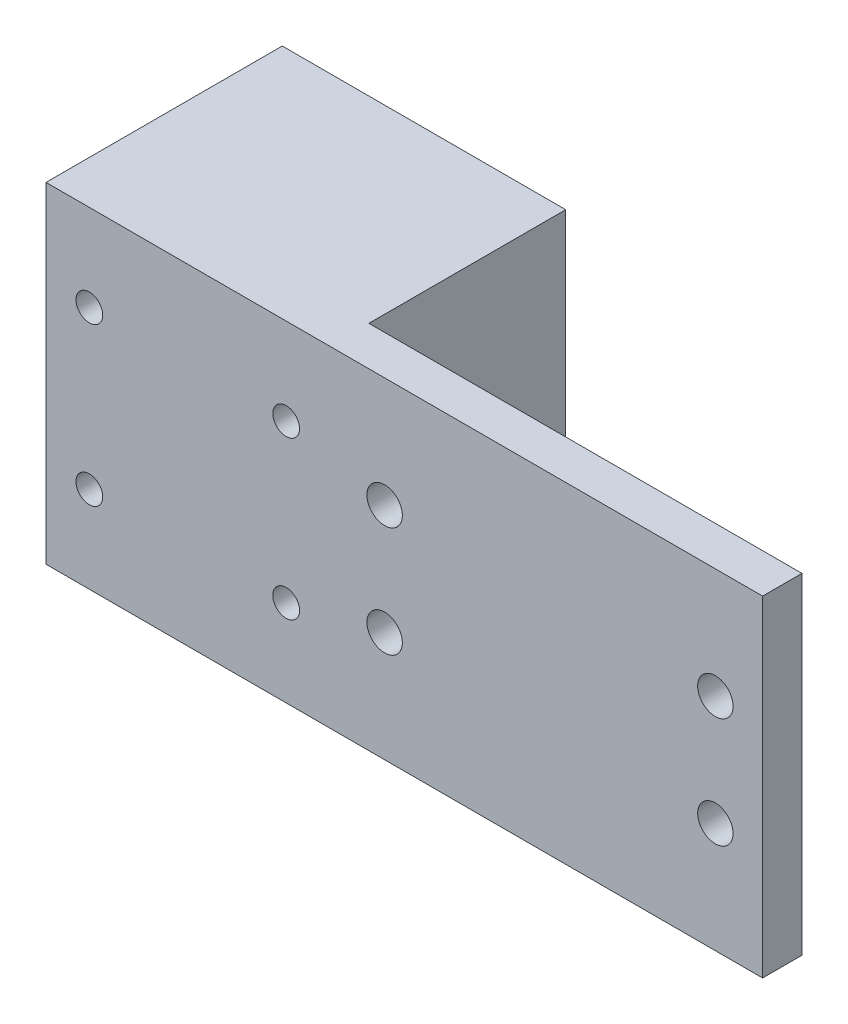
ISO-10303-21;
HEADER;
FILE_DESCRIPTION(('STEP AP214'),'2;1');
FILE_NAME('part.step','',(''),(''),'','','');
FILE_SCHEMA(('AUTOMOTIVE_DESIGN { 1 0 10303 214 1 1 1 1 }'));
ENDSEC;
DATA;
#1=APPLICATION_CONTEXT('core data for automotive mechanical design processes');
#2=APPLICATION_PROTOCOL_DEFINITION('international standard','automotive_design',2000,#1);
#3=PRODUCT_CONTEXT('',#1,'mechanical');
#4=PRODUCT('Part','Part','',(#3));
#5=PRODUCT_RELATED_PRODUCT_CATEGORY('part','',(#4));
#6=PRODUCT_DEFINITION_FORMATION('','',#4);
#7=PRODUCT_DEFINITION_CONTEXT('part definition',#1,'design');
#8=PRODUCT_DEFINITION('design','',#6,#7);
#9=PRODUCT_DEFINITION_SHAPE('','',#8);
#10=(LENGTH_UNIT() NAMED_UNIT(*) SI_UNIT(.MILLI.,.METRE.));
#11=(NAMED_UNIT(*) PLANE_ANGLE_UNIT() SI_UNIT($,.RADIAN.));
#12=(NAMED_UNIT(*) SI_UNIT($,.STERADIAN.) SOLID_ANGLE_UNIT());
#13=UNCERTAINTY_MEASURE_WITH_UNIT(LENGTH_MEASURE(1.E-05),#10,'distance_accuracy_value','');
#14=(GEOMETRIC_REPRESENTATION_CONTEXT(3) GLOBAL_UNCERTAINTY_ASSIGNED_CONTEXT((#13)) GLOBAL_UNIT_ASSIGNED_CONTEXT((#10,
#11,#12)) REPRESENTATION_CONTEXT('',''));
#15=CARTESIAN_POINT('',(0.,0.,0.));
#16=DIRECTION('',(0.,0.,1.));
#17=DIRECTION('',(1.,0.,0.));
#18=AXIS2_PLACEMENT_3D('',#15,#16,#17);
#19=CARTESIAN_POINT('',(91.,42.,0.));
#20=DIRECTION('',(0.,0.,-1.));
#21=DIRECTION('',(-1.,0.,0.));
#22=AXIS2_PLACEMENT_3D('',#19,#20,#21);
#23=PLANE('',#22);
#24=CARTESIAN_POINT('',(5.5,31.,0.));
#25=DIRECTION('',(0.,0.,1.));
#26=DIRECTION('',(1.,0.,0.));
#27=AXIS2_PLACEMENT_3D('',#24,#25,#26);
#28=CIRCLE('',#27,1.69999999999999);
#29=CARTESIAN_POINT('',(7.19999999999999,31.,0.));
#30=VERTEX_POINT('',#29);
#31=EDGE_CURVE('E192',#30,#30,#28,.T.);
#32=ORIENTED_EDGE('',*,*,#31,.F.);
#33=EDGE_LOOP('',(#32));
#34=FACE_BOUND('',#33,.T.);
#35=CARTESIAN_POINT('',(5.5,11.,0.));
#36=DIRECTION('',(0.,0.,1.));
#37=DIRECTION('',(1.,0.,0.));
#38=AXIS2_PLACEMENT_3D('',#35,#36,#37);
#39=CIRCLE('',#38,1.69999999999999);
#40=CARTESIAN_POINT('',(7.19999999999999,11.,0.));
#41=VERTEX_POINT('',#40);
#42=EDGE_CURVE('E196',#41,#41,#39,.T.);
#43=ORIENTED_EDGE('',*,*,#42,.F.);
#44=EDGE_LOOP('',(#43));
#45=FACE_BOUND('',#44,.T.);
#46=CARTESIAN_POINT('',(30.5,31.,0.));
#47=DIRECTION('',(0.,0.,1.));
#48=DIRECTION('',(1.,0.,0.));
#49=AXIS2_PLACEMENT_3D('',#46,#47,#48);
#50=CIRCLE('',#49,1.69999999999999);
#51=CARTESIAN_POINT('',(32.2,31.,0.));
#52=VERTEX_POINT('',#51);
#53=EDGE_CURVE('E200',#52,#52,#50,.T.);
#54=ORIENTED_EDGE('',*,*,#53,.F.);
#55=EDGE_LOOP('',(#54));
#56=FACE_BOUND('',#55,.T.);
#57=CARTESIAN_POINT('',(30.5,11.,0.));
#58=DIRECTION('',(0.,0.,1.));
#59=DIRECTION('',(1.,0.,0.));
#60=AXIS2_PLACEMENT_3D('',#57,#58,#59);
#61=CIRCLE('',#60,1.7);
#62=CARTESIAN_POINT('',(32.2,11.,0.));
#63=VERTEX_POINT('',#62);
#64=EDGE_CURVE('E204',#63,#63,#61,.T.);
#65=ORIENTED_EDGE('',*,*,#64,.F.);
#66=EDGE_LOOP('',(#65));
#67=FACE_BOUND('',#66,.T.);
#68=CARTESIAN_POINT('',(85.,28.,0.));
#69=DIRECTION('',(0.,0.,1.));
#70=DIRECTION('',(1.,0.,0.));
#71=AXIS2_PLACEMENT_3D('',#68,#69,#70);
#72=CIRCLE('',#71,2.24999999999999);
#73=CARTESIAN_POINT('',(87.25,28.,0.));
#74=VERTEX_POINT('',#73);
#75=EDGE_CURVE('E154',#74,#74,#72,.T.);
#76=ORIENTED_EDGE('',*,*,#75,.F.);
#77=EDGE_LOOP('',(#76));
#78=FACE_BOUND('',#77,.T.);
#79=CARTESIAN_POINT('',(85.,14.,0.));
#80=DIRECTION('',(0.,0.,1.));
#81=DIRECTION('',(1.,0.,0.));
#82=AXIS2_PLACEMENT_3D('',#79,#80,#81);
#83=CIRCLE('',#82,2.24999999999999);
#84=CARTESIAN_POINT('',(87.25,14.,0.));
#85=VERTEX_POINT('',#84);
#86=EDGE_CURVE('E144',#85,#85,#83,.T.);
#87=ORIENTED_EDGE('',*,*,#86,.F.);
#88=EDGE_LOOP('',(#87));
#89=FACE_BOUND('',#88,.T.);
#90=CARTESIAN_POINT('',(43.,28.,0.));
#91=DIRECTION('',(0.,0.,1.));
#92=DIRECTION('',(1.,0.,0.));
#93=AXIS2_PLACEMENT_3D('',#90,#91,#92);
#94=CIRCLE('',#93,2.24999999999999);
#95=CARTESIAN_POINT('',(45.25,28.,0.));
#96=VERTEX_POINT('',#95);
#97=EDGE_CURVE('E141',#96,#96,#94,.T.);
#98=ORIENTED_EDGE('',*,*,#97,.F.);
#99=EDGE_LOOP('',(#98));
#100=FACE_BOUND('',#99,.T.);
#101=CARTESIAN_POINT('',(43.,14.,0.));
#102=DIRECTION('',(0.,0.,1.));
#103=DIRECTION('',(1.,0.,0.));
#104=AXIS2_PLACEMENT_3D('',#101,#102,#103);
#105=CIRCLE('',#104,2.24999999999999);
#106=CARTESIAN_POINT('',(45.25,14.,0.));
#107=VERTEX_POINT('',#106);
#108=EDGE_CURVE('E140',#107,#107,#105,.T.);
#109=ORIENTED_EDGE('',*,*,#108,.F.);
#110=EDGE_LOOP('',(#109));
#111=FACE_BOUND('',#110,.T.);
#112=DIRECTION('',(1.,0.,0.));
#113=VECTOR('',#112,1.);
#114=CARTESIAN_POINT('',(91.,0.,0.));
#115=LINE('',#114,#113);
#116=CARTESIAN_POINT('',(0.,0.,0.));
#117=VERTEX_POINT('',#116);
#118=CARTESIAN_POINT('',(91.,0.,0.));
#119=VERTEX_POINT('',#118);
#120=EDGE_CURVE('E121',#117,#119,#115,.T.);
#121=ORIENTED_EDGE('',*,*,#120,.T.);
#122=DIRECTION('',(0.,-1.,0.));
#123=VECTOR('',#122,1.);
#124=CARTESIAN_POINT('',(91.,42.,0.));
#125=LINE('',#124,#123);
#126=CARTESIAN_POINT('',(91.,42.,0.));
#127=VERTEX_POINT('',#126);
#128=EDGE_CURVE('E11',#127,#119,#125,.T.);
#129=ORIENTED_EDGE('',*,*,#128,.F.);
#130=DIRECTION('',(1.,0.,0.));
#131=VECTOR('',#130,1.);
#132=CARTESIAN_POINT('',(91.,42.,0.));
#133=LINE('',#132,#131);
#134=CARTESIAN_POINT('',(0.,42.,0.));
#135=VERTEX_POINT('',#134);
#136=EDGE_CURVE('E132',#135,#127,#133,.T.);
#137=ORIENTED_EDGE('',*,*,#136,.F.);
#138=DIRECTION('',(0.,-1.,0.));
#139=VECTOR('',#138,1.);
#140=CARTESIAN_POINT('',(0.,42.,0.));
#141=LINE('',#140,#139);
#142=EDGE_CURVE('E117',#135,#117,#141,.T.);
#143=ORIENTED_EDGE('',*,*,#142,.T.);
#144=EDGE_LOOP('',(#121,#129,#137,#143));
#145=FACE_BOUND('',#144,.T.);
#146=ADVANCED_FACE('F35',(#34,#45,#56,#67,#78,#89,#100,#111,#145),#23,.F.);
#147=CARTESIAN_POINT('',(91.,42.,-5.00000000000001));
#148=DIRECTION('',(-1.,0.,0.));
#149=DIRECTION('',(0.,0.,1.));
#150=AXIS2_PLACEMENT_3D('',#147,#148,#149);
#151=PLANE('',#150);
#152=DIRECTION('',(0.,0.,-1.));
#153=VECTOR('',#152,1.);
#154=CARTESIAN_POINT('',(91.,0.,-5.00000000000001));
#155=LINE('',#154,#153);
#156=CARTESIAN_POINT('',(91.,0.,-5.00000000000001));
#157=VERTEX_POINT('',#156);
#158=EDGE_CURVE('E124',#119,#157,#155,.T.);
#159=ORIENTED_EDGE('',*,*,#158,.T.);
#160=DIRECTION('',(0.,-1.,0.));
#161=VECTOR('',#160,1.);
#162=CARTESIAN_POINT('',(91.,42.,-5.00000000000001));
#163=LINE('',#162,#161);
#164=CARTESIAN_POINT('',(91.,42.,-5.00000000000001));
#165=VERTEX_POINT('',#164);
#166=EDGE_CURVE('E44',#165,#157,#163,.T.);
#167=ORIENTED_EDGE('',*,*,#166,.F.);
#168=DIRECTION('',(0.,0.,-1.));
#169=VECTOR('',#168,1.);
#170=CARTESIAN_POINT('',(91.,42.,-5.00000000000001));
#171=LINE('',#170,#169);
#172=EDGE_CURVE('E90',#127,#165,#171,.T.);
#173=ORIENTED_EDGE('',*,*,#172,.F.);
#174=ORIENTED_EDGE('',*,*,#128,.T.);
#175=EDGE_LOOP('',(#159,#167,#173,#174));
#176=FACE_BOUND('',#175,.T.);
#177=ADVANCED_FACE('F165',(#176),#151,.F.);
#178=CARTESIAN_POINT('',(36.,42.,-5.00000000000002));
#179=DIRECTION('',(0.,0.,1.));
#180=DIRECTION('',(1.,0.,0.));
#181=AXIS2_PLACEMENT_3D('',#178,#179,#180);
#182=PLANE('',#181);
#183=CARTESIAN_POINT('',(85.,28.,-5.00000000000001));
#184=DIRECTION('',(0.,0.,1.));
#185=DIRECTION('',(1.,0.,0.));
#186=AXIS2_PLACEMENT_3D('',#183,#184,#185);
#187=CIRCLE('',#186,2.24999999999999);
#188=CARTESIAN_POINT('',(87.25,28.,-5.00000000000001));
#189=VERTEX_POINT('',#188);
#190=EDGE_CURVE('E38',#189,#189,#187,.T.);
#191=ORIENTED_EDGE('',*,*,#190,.T.);
#192=EDGE_LOOP('',(#191));
#193=FACE_BOUND('',#192,.T.);
#194=CARTESIAN_POINT('',(85.,14.,-5.00000000000001));
#195=DIRECTION('',(0.,0.,1.));
#196=DIRECTION('',(1.,0.,0.));
#197=AXIS2_PLACEMENT_3D('',#194,#195,#196);
#198=CIRCLE('',#197,2.24999999999999);
#199=CARTESIAN_POINT('',(87.25,14.,-5.00000000000001));
#200=VERTEX_POINT('',#199);
#201=EDGE_CURVE('E142',#200,#200,#198,.T.);
#202=ORIENTED_EDGE('',*,*,#201,.T.);
#203=EDGE_LOOP('',(#202));
#204=FACE_BOUND('',#203,.T.);
#205=CARTESIAN_POINT('',(43.,28.,-5.00000000000001));
#206=DIRECTION('',(0.,0.,1.));
#207=DIRECTION('',(1.,0.,0.));
#208=AXIS2_PLACEMENT_3D('',#205,#206,#207);
#209=CIRCLE('',#208,2.24999999999999);
#210=CARTESIAN_POINT('',(45.25,28.,-5.00000000000001));
#211=VERTEX_POINT('',#210);
#212=EDGE_CURVE('E138',#211,#211,#209,.T.);
#213=ORIENTED_EDGE('',*,*,#212,.T.);
#214=EDGE_LOOP('',(#213));
#215=FACE_BOUND('',#214,.T.);
#216=CARTESIAN_POINT('',(43.,14.,-5.00000000000001));
#217=DIRECTION('',(0.,0.,1.));
#218=DIRECTION('',(1.,0.,0.));
#219=AXIS2_PLACEMENT_3D('',#216,#217,#218);
#220=CIRCLE('',#219,2.24999999999999);
#221=CARTESIAN_POINT('',(45.25,14.,-5.00000000000001));
#222=VERTEX_POINT('',#221);
#223=EDGE_CURVE('E125',#222,#222,#220,.T.);
#224=ORIENTED_EDGE('',*,*,#223,.T.);
#225=EDGE_LOOP('',(#224));
#226=FACE_BOUND('',#225,.T.);
#227=DIRECTION('',(-1.,0.,0.));
#228=VECTOR('',#227,1.);
#229=CARTESIAN_POINT('',(36.,0.,-5.00000000000002));
#230=LINE('',#229,#228);
#231=CARTESIAN_POINT('',(36.,0.,-5.00000000000002));
#232=VERTEX_POINT('',#231);
#233=EDGE_CURVE('E127',#157,#232,#230,.T.);
#234=ORIENTED_EDGE('',*,*,#233,.T.);
#235=DIRECTION('',(0.,-1.,0.));
#236=VECTOR('',#235,1.);
#237=CARTESIAN_POINT('',(36.,42.,-5.00000000000002));
#238=LINE('',#237,#236);
#239=CARTESIAN_POINT('',(36.,42.,-5.00000000000002));
#240=VERTEX_POINT('',#239);
#241=EDGE_CURVE('E112',#240,#232,#238,.T.);
#242=ORIENTED_EDGE('',*,*,#241,.F.);
#243=DIRECTION('',(-1.,0.,0.));
#244=VECTOR('',#243,1.);
#245=CARTESIAN_POINT('',(36.,42.,-5.00000000000002));
#246=LINE('',#245,#244);
#247=EDGE_CURVE('E103',#165,#240,#246,.T.);
#248=ORIENTED_EDGE('',*,*,#247,.F.);
#249=ORIENTED_EDGE('',*,*,#166,.T.);
#250=EDGE_LOOP('',(#234,#242,#248,#249));
#251=FACE_BOUND('',#250,.T.);
#252=ADVANCED_FACE('F168',(#193,#204,#215,#226,#251),#182,.F.);
#253=CARTESIAN_POINT('',(36.,42.,-30.));
#254=DIRECTION('',(-1.,0.,0.));
#255=DIRECTION('',(0.,0.,1.));
#256=AXIS2_PLACEMENT_3D('',#253,#254,#255);
#257=PLANE('',#256);
#258=DIRECTION('',(0.,0.,-1.));
#259=VECTOR('',#258,1.);
#260=CARTESIAN_POINT('',(36.,0.,-30.));
#261=LINE('',#260,#259);
#262=CARTESIAN_POINT('',(36.,0.,-30.));
#263=VERTEX_POINT('',#262);
#264=EDGE_CURVE('E111',#232,#263,#261,.T.);
#265=ORIENTED_EDGE('',*,*,#264,.T.);
#266=DIRECTION('',(0.,-1.,0.));
#267=VECTOR('',#266,1.);
#268=CARTESIAN_POINT('',(36.,42.,-30.));
#269=LINE('',#268,#267);
#270=CARTESIAN_POINT('',(36.,42.,-30.));
#271=VERTEX_POINT('',#270);
#272=EDGE_CURVE('E108',#271,#263,#269,.T.);
#273=ORIENTED_EDGE('',*,*,#272,.F.);
#274=DIRECTION('',(0.,0.,-1.));
#275=VECTOR('',#274,1.);
#276=CARTESIAN_POINT('',(36.,42.,-30.));
#277=LINE('',#276,#275);
#278=EDGE_CURVE('E97',#240,#271,#277,.T.);
#279=ORIENTED_EDGE('',*,*,#278,.F.);
#280=ORIENTED_EDGE('',*,*,#241,.T.);
#281=EDGE_LOOP('',(#265,#273,#279,#280));
#282=FACE_BOUND('',#281,.T.);
#283=ADVANCED_FACE('F109',(#282),#257,.F.);
#284=CARTESIAN_POINT('',(0.,42.,-30.));
#285=DIRECTION('',(0.,0.,1.));
#286=DIRECTION('',(1.,0.,0.));
#287=AXIS2_PLACEMENT_3D('',#284,#285,#286);
#288=PLANE('',#287);
#289=CARTESIAN_POINT('',(5.5,31.,-30.));
#290=DIRECTION('',(0.,0.,1.));
#291=DIRECTION('',(1.,0.,0.));
#292=AXIS2_PLACEMENT_3D('',#289,#290,#291);
#293=CIRCLE('',#292,1.69999999999999);
#294=CARTESIAN_POINT('',(7.19999999999999,31.,-30.));
#295=VERTEX_POINT('',#294);
#296=EDGE_CURVE('E330',#295,#295,#293,.T.);
#297=ORIENTED_EDGE('',*,*,#296,.T.);
#298=EDGE_LOOP('',(#297));
#299=FACE_BOUND('',#298,.T.);
#300=CARTESIAN_POINT('',(5.5,11.,-30.));
#301=DIRECTION('',(0.,0.,1.));
#302=DIRECTION('',(1.,0.,0.));
#303=AXIS2_PLACEMENT_3D('',#300,#301,#302);
#304=CIRCLE('',#303,1.69999999999999);
#305=CARTESIAN_POINT('',(7.19999999999999,11.,-30.));
#306=VERTEX_POINT('',#305);
#307=EDGE_CURVE('E335',#306,#306,#304,.T.);
#308=ORIENTED_EDGE('',*,*,#307,.T.);
#309=EDGE_LOOP('',(#308));
#310=FACE_BOUND('',#309,.T.);
#311=CARTESIAN_POINT('',(30.5,31.,-30.));
#312=DIRECTION('',(0.,0.,1.));
#313=DIRECTION('',(1.,0.,0.));
#314=AXIS2_PLACEMENT_3D('',#311,#312,#313);
#315=CIRCLE('',#314,1.69999999999999);
#316=CARTESIAN_POINT('',(32.2,31.,-30.));
#317=VERTEX_POINT('',#316);
#318=EDGE_CURVE('E339',#317,#317,#315,.T.);
#319=ORIENTED_EDGE('',*,*,#318,.T.);
#320=EDGE_LOOP('',(#319));
#321=FACE_BOUND('',#320,.T.);
#322=CARTESIAN_POINT('',(30.5,11.,-30.));
#323=DIRECTION('',(0.,0.,1.));
#324=DIRECTION('',(1.,0.,0.));
#325=AXIS2_PLACEMENT_3D('',#322,#323,#324);
#326=CIRCLE('',#325,1.69999999999999);
#327=CARTESIAN_POINT('',(32.2,11.,-30.));
#328=VERTEX_POINT('',#327);
#329=EDGE_CURVE('E342',#328,#328,#326,.T.);
#330=ORIENTED_EDGE('',*,*,#329,.T.);
#331=EDGE_LOOP('',(#330));
#332=FACE_BOUND('',#331,.T.);
#333=DIRECTION('',(-1.,0.,0.));
#334=VECTOR('',#333,1.);
#335=CARTESIAN_POINT('',(0.,0.,-30.));
#336=LINE('',#335,#334);
#337=CARTESIAN_POINT('',(0.,0.,-30.));
#338=VERTEX_POINT('',#337);
#339=EDGE_CURVE('E76',#263,#338,#336,.T.);
#340=ORIENTED_EDGE('',*,*,#339,.T.);
#341=DIRECTION('',(0.,-1.,0.));
#342=VECTOR('',#341,1.);
#343=CARTESIAN_POINT('',(0.,42.,-30.));
#344=LINE('',#343,#342);
#345=CARTESIAN_POINT('',(0.,42.,-30.));
#346=VERTEX_POINT('',#345);
#347=EDGE_CURVE('E113',#346,#338,#344,.T.);
#348=ORIENTED_EDGE('',*,*,#347,.F.);
#349=DIRECTION('',(-1.,0.,0.));
#350=VECTOR('',#349,1.);
#351=CARTESIAN_POINT('',(0.,42.,-30.));
#352=LINE('',#351,#350);
#353=EDGE_CURVE('E101',#271,#346,#352,.T.);
#354=ORIENTED_EDGE('',*,*,#353,.F.);
#355=ORIENTED_EDGE('',*,*,#272,.T.);
#356=EDGE_LOOP('',(#340,#348,#354,#355));
#357=FACE_BOUND('',#356,.T.);
#358=ADVANCED_FACE('F115',(#299,#310,#321,#332,#357),#288,.F.);
#359=CARTESIAN_POINT('',(0.,42.,0.));
#360=DIRECTION('',(1.,0.,0.));
#361=DIRECTION('',(0.,0.,-1.));
#362=AXIS2_PLACEMENT_3D('',#359,#360,#361);
#363=PLANE('',#362);
#364=DIRECTION('',(0.,0.,1.));
#365=VECTOR('',#364,1.);
#366=CARTESIAN_POINT('',(0.,0.,0.));
#367=LINE('',#366,#365);
#368=EDGE_CURVE('E82',#338,#117,#367,.T.);
#369=ORIENTED_EDGE('',*,*,#368,.T.);
#370=ORIENTED_EDGE('',*,*,#142,.F.);
#371=DIRECTION('',(0.,0.,1.));
#372=VECTOR('',#371,1.);
#373=CARTESIAN_POINT('',(0.,42.,0.));
#374=LINE('',#373,#372);
#375=EDGE_CURVE('E53',#346,#135,#374,.T.);
#376=ORIENTED_EDGE('',*,*,#375,.F.);
#377=ORIENTED_EDGE('',*,*,#347,.T.);
#378=EDGE_LOOP('',(#369,#370,#376,#377));
#379=FACE_BOUND('',#378,.T.);
#380=ADVANCED_FACE('F173',(#379),#363,.F.);
#381=CARTESIAN_POINT('',(0.,42.,0.));
#382=DIRECTION('',(0.,-1.,0.));
#383=DIRECTION('',(0.,0.,-1.));
#384=AXIS2_PLACEMENT_3D('',#381,#382,#383);
#385=PLANE('',#384);
#386=ORIENTED_EDGE('',*,*,#136,.T.);
#387=ORIENTED_EDGE('',*,*,#172,.T.);
#388=ORIENTED_EDGE('',*,*,#247,.T.);
#389=ORIENTED_EDGE('',*,*,#278,.T.);
#390=ORIENTED_EDGE('',*,*,#353,.T.);
#391=ORIENTED_EDGE('',*,*,#375,.T.);
#392=EDGE_LOOP('',(#386,#387,#388,#389,#390,#391));
#393=FACE_BOUND('',#392,.T.);
#394=ADVANCED_FACE('F99',(#393),#385,.F.);
#395=CARTESIAN_POINT('',(0.,0.,0.));
#396=DIRECTION('',(0.,-1.,0.));
#397=DIRECTION('',(0.,0.,-1.));
#398=AXIS2_PLACEMENT_3D('',#395,#396,#397);
#399=PLANE('',#398);
#400=ORIENTED_EDGE('',*,*,#120,.F.);
#401=ORIENTED_EDGE('',*,*,#368,.F.);
#402=ORIENTED_EDGE('',*,*,#339,.F.);
#403=ORIENTED_EDGE('',*,*,#264,.F.);
#404=ORIENTED_EDGE('',*,*,#233,.F.);
#405=ORIENTED_EDGE('',*,*,#158,.F.);
#406=EDGE_LOOP('',(#400,#401,#402,#403,#404,#405));
#407=FACE_BOUND('',#406,.T.);
#408=ADVANCED_FACE('F171',(#407),#399,.T.);
#409=CARTESIAN_POINT('',(43.,14.,0.));
#410=DIRECTION('',(0.,0.,1.));
#411=DIRECTION('',(1.,0.,0.));
#412=AXIS2_PLACEMENT_3D('',#409,#410,#411);
#413=CYLINDRICAL_SURFACE('',#412,2.24999999999999);
#414=ORIENTED_EDGE('',*,*,#108,.T.);
#415=EDGE_LOOP('',(#414));
#416=FACE_BOUND('',#415,.T.);
#417=ORIENTED_EDGE('',*,*,#223,.F.);
#418=EDGE_LOOP('',(#417));
#419=FACE_BOUND('',#418,.T.);
#420=ADVANCED_FACE('F213',(#416,#419),#413,.F.);
#421=CARTESIAN_POINT('',(43.,28.,0.));
#422=DIRECTION('',(0.,0.,1.));
#423=DIRECTION('',(1.,0.,0.));
#424=AXIS2_PLACEMENT_3D('',#421,#422,#423);
#425=CYLINDRICAL_SURFACE('',#424,2.24999999999999);
#426=ORIENTED_EDGE('',*,*,#97,.T.);
#427=EDGE_LOOP('',(#426));
#428=FACE_BOUND('',#427,.T.);
#429=ORIENTED_EDGE('',*,*,#212,.F.);
#430=EDGE_LOOP('',(#429));
#431=FACE_BOUND('',#430,.T.);
#432=ADVANCED_FACE('F216',(#428,#431),#425,.F.);
#433=CARTESIAN_POINT('',(85.,14.,0.));
#434=DIRECTION('',(0.,0.,1.));
#435=DIRECTION('',(1.,0.,0.));
#436=AXIS2_PLACEMENT_3D('',#433,#434,#435);
#437=CYLINDRICAL_SURFACE('',#436,2.24999999999999);
#438=ORIENTED_EDGE('',*,*,#86,.T.);
#439=EDGE_LOOP('',(#438));
#440=FACE_BOUND('',#439,.T.);
#441=ORIENTED_EDGE('',*,*,#201,.F.);
#442=EDGE_LOOP('',(#441));
#443=FACE_BOUND('',#442,.T.);
#444=ADVANCED_FACE('F232',(#440,#443),#437,.F.);
#445=CARTESIAN_POINT('',(85.,28.,0.));
#446=DIRECTION('',(0.,0.,1.));
#447=DIRECTION('',(1.,0.,0.));
#448=AXIS2_PLACEMENT_3D('',#445,#446,#447);
#449=CYLINDRICAL_SURFACE('',#448,2.24999999999999);
#450=ORIENTED_EDGE('',*,*,#75,.T.);
#451=EDGE_LOOP('',(#450));
#452=FACE_BOUND('',#451,.T.);
#453=ORIENTED_EDGE('',*,*,#190,.F.);
#454=EDGE_LOOP('',(#453));
#455=FACE_BOUND('',#454,.T.);
#456=ADVANCED_FACE('F238',(#452,#455),#449,.F.);
#457=CARTESIAN_POINT('',(30.5,11.,0.));
#458=DIRECTION('',(0.,0.,1.));
#459=DIRECTION('',(1.,0.,0.));
#460=AXIS2_PLACEMENT_3D('',#457,#458,#459);
#461=CYLINDRICAL_SURFACE('',#460,1.69999999999999);
#462=ORIENTED_EDGE('',*,*,#329,.F.);
#463=EDGE_LOOP('',(#462));
#464=FACE_BOUND('',#463,.T.);
#465=ORIENTED_EDGE('',*,*,#64,.T.);
#466=EDGE_LOOP('',(#465));
#467=FACE_BOUND('',#466,.T.);
#468=ADVANCED_FACE('F270',(#464,#467),#461,.F.);
#469=CARTESIAN_POINT('',(30.5,31.,0.));
#470=DIRECTION('',(0.,0.,1.));
#471=DIRECTION('',(1.,0.,0.));
#472=AXIS2_PLACEMENT_3D('',#469,#470,#471);
#473=CYLINDRICAL_SURFACE('',#472,1.69999999999999);
#474=ORIENTED_EDGE('',*,*,#318,.F.);
#475=EDGE_LOOP('',(#474));
#476=FACE_BOUND('',#475,.T.);
#477=ORIENTED_EDGE('',*,*,#53,.T.);
#478=EDGE_LOOP('',(#477));
#479=FACE_BOUND('',#478,.T.);
#480=ADVANCED_FACE('F293',(#476,#479),#473,.F.);
#481=CARTESIAN_POINT('',(5.5,11.,0.));
#482=DIRECTION('',(0.,0.,1.));
#483=DIRECTION('',(1.,0.,0.));
#484=AXIS2_PLACEMENT_3D('',#481,#482,#483);
#485=CYLINDRICAL_SURFACE('',#484,1.69999999999999);
#486=ORIENTED_EDGE('',*,*,#307,.F.);
#487=EDGE_LOOP('',(#486));
#488=FACE_BOUND('',#487,.T.);
#489=ORIENTED_EDGE('',*,*,#42,.T.);
#490=EDGE_LOOP('',(#489));
#491=FACE_BOUND('',#490,.T.);
#492=ADVANCED_FACE('F303',(#488,#491),#485,.F.);
#493=CARTESIAN_POINT('',(5.5,31.,0.));
#494=DIRECTION('',(0.,0.,1.));
#495=DIRECTION('',(1.,0.,0.));
#496=AXIS2_PLACEMENT_3D('',#493,#494,#495);
#497=CYLINDRICAL_SURFACE('',#496,1.69999999999999);
#498=ORIENTED_EDGE('',*,*,#296,.F.);
#499=EDGE_LOOP('',(#498));
#500=FACE_BOUND('',#499,.T.);
#501=ORIENTED_EDGE('',*,*,#31,.T.);
#502=EDGE_LOOP('',(#501));
#503=FACE_BOUND('',#502,.T.);
#504=ADVANCED_FACE('F313',(#500,#503),#497,.F.);
#505=CLOSED_SHELL('',(#146,#177,#252,#283,#358,#380,#394,#408,#420,#432,#444,#456,#468,#480,
#492,#504));
#506=MANIFOLD_SOLID_BREP('B2',#505);
#507=ADVANCED_BREP_SHAPE_REPRESENTATION('',(#18,#506),#14);
#508=SHAPE_DEFINITION_REPRESENTATION(#9,#507);
ENDSEC;
END-ISO-10303-21;
